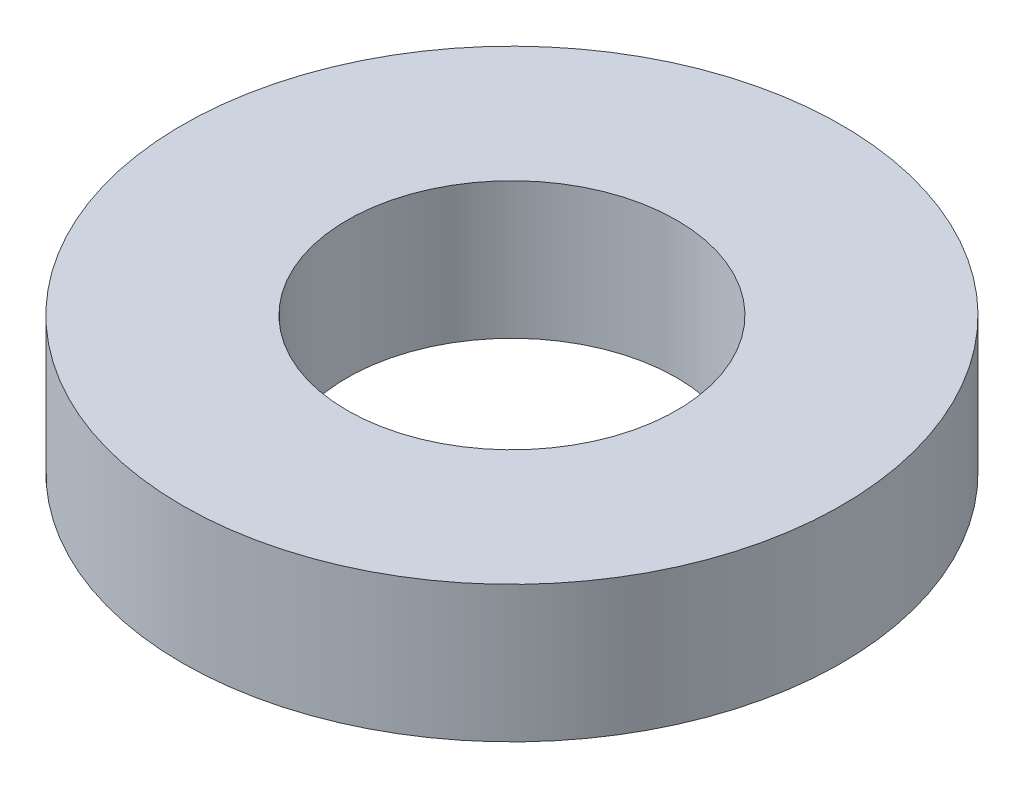
ISO-10303-21;
HEADER;
FILE_DESCRIPTION(('STEP AP214'),'2;1');
FILE_NAME('part.step','',(''),(''),'','','');
FILE_SCHEMA(('AUTOMOTIVE_DESIGN { 1 0 10303 214 1 1 1 1 }'));
ENDSEC;
DATA;
#1=APPLICATION_CONTEXT('core data for automotive mechanical design processes');
#2=APPLICATION_PROTOCOL_DEFINITION('international standard','automotive_design',2000,#1);
#3=PRODUCT_CONTEXT('',#1,'mechanical');
#4=PRODUCT('Part','Part','',(#3));
#5=PRODUCT_RELATED_PRODUCT_CATEGORY('part','',(#4));
#6=PRODUCT_DEFINITION_FORMATION('','',#4);
#7=PRODUCT_DEFINITION_CONTEXT('part definition',#1,'design');
#8=PRODUCT_DEFINITION('design','',#6,#7);
#9=PRODUCT_DEFINITION_SHAPE('','',#8);
#10=(LENGTH_UNIT() NAMED_UNIT(*) SI_UNIT(.MILLI.,.METRE.));
#11=(NAMED_UNIT(*) PLANE_ANGLE_UNIT() SI_UNIT($,.RADIAN.));
#12=(NAMED_UNIT(*) SI_UNIT($,.STERADIAN.) SOLID_ANGLE_UNIT());
#13=UNCERTAINTY_MEASURE_WITH_UNIT(LENGTH_MEASURE(1.E-05),#10,'distance_accuracy_value','');
#14=(GEOMETRIC_REPRESENTATION_CONTEXT(3) GLOBAL_UNCERTAINTY_ASSIGNED_CONTEXT((#13)) GLOBAL_UNIT_ASSIGNED_CONTEXT((#10,
#11,#12)) REPRESENTATION_CONTEXT('',''));
#15=CARTESIAN_POINT('',(0.,0.,0.));
#16=DIRECTION('',(0.,0.,1.));
#17=DIRECTION('',(1.,0.,0.));
#18=AXIS2_PLACEMENT_3D('',#15,#16,#17);
#19=CARTESIAN_POINT('',(0.,2.07,0.));
#20=DIRECTION('',(0.,-1.,0.));
#21=DIRECTION('',(0.,0.,-1.));
#22=AXIS2_PLACEMENT_3D('',#19,#20,#21);
#23=CYLINDRICAL_SURFACE('',#22,5.);
#24=CARTESIAN_POINT('',(0.,2.07,0.));
#25=DIRECTION('',(0.,1.,0.));
#26=DIRECTION('',(0.,0.,1.));
#27=AXIS2_PLACEMENT_3D('',#24,#25,#26);
#28=CIRCLE('',#27,5.);
#29=CARTESIAN_POINT('',(0.,2.07,5.));
#30=VERTEX_POINT('',#29);
#31=EDGE_CURVE('E10',#30,#30,#28,.T.);
#32=ORIENTED_EDGE('',*,*,#31,.F.);
#33=EDGE_LOOP('',(#32));
#34=FACE_BOUND('',#33,.T.);
#35=CARTESIAN_POINT('',(0.,0.,0.));
#36=DIRECTION('',(0.,1.,0.));
#37=DIRECTION('',(0.,0.,1.));
#38=AXIS2_PLACEMENT_3D('',#35,#36,#37);
#39=CIRCLE('',#38,5.);
#40=CARTESIAN_POINT('',(0.,0.,5.));
#41=VERTEX_POINT('',#40);
#42=EDGE_CURVE('E38',#41,#41,#39,.T.);
#43=ORIENTED_EDGE('',*,*,#42,.T.);
#44=EDGE_LOOP('',(#43));
#45=FACE_BOUND('',#44,.T.);
#46=ADVANCED_FACE('F35',(#34,#45),#23,.T.);
#47=CARTESIAN_POINT('',(0.,2.07,0.));
#48=DIRECTION('',(0.,1.,0.));
#49=DIRECTION('',(0.,0.,1.));
#50=AXIS2_PLACEMENT_3D('',#47,#48,#49);
#51=PLANE('',#50);
#52=CARTESIAN_POINT('',(0.,2.07,0.));
#53=DIRECTION('',(0.,1.,0.));
#54=DIRECTION('',(0.,0.,1.));
#55=AXIS2_PLACEMENT_3D('',#52,#53,#54);
#56=CIRCLE('',#55,2.5);
#57=CARTESIAN_POINT('',(0.,2.07,2.5));
#58=VERTEX_POINT('',#57);
#59=EDGE_CURVE('E47',#58,#58,#56,.T.);
#60=ORIENTED_EDGE('',*,*,#59,.F.);
#61=EDGE_LOOP('',(#60));
#62=FACE_BOUND('',#61,.T.);
#63=ORIENTED_EDGE('',*,*,#31,.T.);
#64=EDGE_LOOP('',(#63));
#65=FACE_BOUND('',#64,.T.);
#66=ADVANCED_FACE('F62',(#62,#65),#51,.T.);
#67=CARTESIAN_POINT('',(0.,0.,0.));
#68=DIRECTION('',(0.,1.,0.));
#69=DIRECTION('',(0.,0.,1.));
#70=AXIS2_PLACEMENT_3D('',#67,#68,#69);
#71=PLANE('',#70);
#72=CARTESIAN_POINT('',(0.,0.,0.));
#73=DIRECTION('',(0.,1.,0.));
#74=DIRECTION('',(0.,0.,1.));
#75=AXIS2_PLACEMENT_3D('',#72,#73,#74);
#76=CIRCLE('',#75,2.5);
#77=CARTESIAN_POINT('',(0.,0.,2.5));
#78=VERTEX_POINT('',#77);
#79=EDGE_CURVE('E45',#78,#78,#76,.T.);
#80=ORIENTED_EDGE('',*,*,#79,.T.);
#81=EDGE_LOOP('',(#80));
#82=FACE_BOUND('',#81,.T.);
#83=ORIENTED_EDGE('',*,*,#42,.F.);
#84=EDGE_LOOP('',(#83));
#85=FACE_BOUND('',#84,.T.);
#86=ADVANCED_FACE('F53',(#82,#85),#71,.F.);
#87=CARTESIAN_POINT('',(0.,0.,0.));
#88=DIRECTION('',(0.,1.,0.));
#89=DIRECTION('',(0.,0.,1.));
#90=AXIS2_PLACEMENT_3D('',#87,#88,#89);
#91=CYLINDRICAL_SURFACE('',#90,2.5);
#92=ORIENTED_EDGE('',*,*,#79,.F.);
#93=EDGE_LOOP('',(#92));
#94=FACE_BOUND('',#93,.T.);
#95=ORIENTED_EDGE('',*,*,#59,.T.);
#96=EDGE_LOOP('',(#95));
#97=FACE_BOUND('',#96,.T.);
#98=ADVANCED_FACE('F56',(#94,#97),#91,.F.);
#99=CLOSED_SHELL('',(#46,#66,#86,#98));
#100=MANIFOLD_SOLID_BREP('B2',#99);
#101=ADVANCED_BREP_SHAPE_REPRESENTATION('',(#18,#100),#14);
#102=SHAPE_DEFINITION_REPRESENTATION(#9,#101);
ENDSEC;
END-ISO-10303-21;
